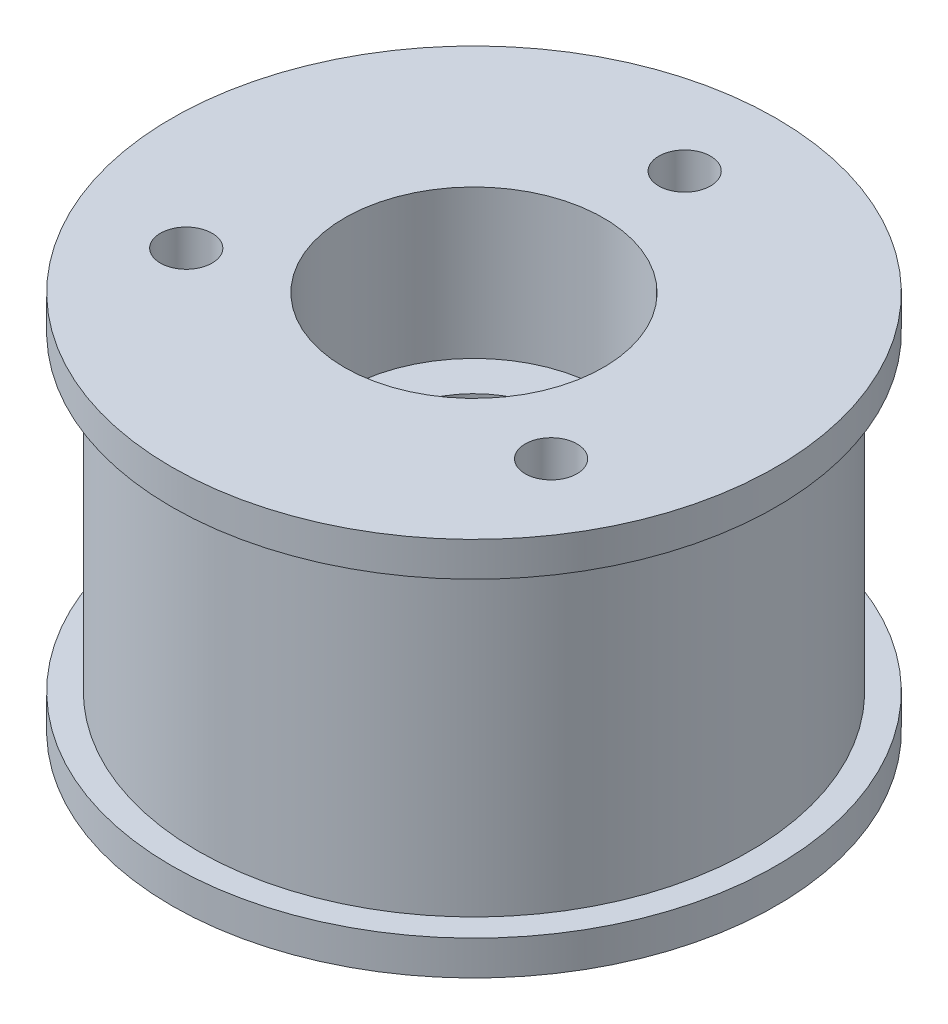
ISO-10303-21;
HEADER;
FILE_DESCRIPTION(('STEP AP214'),'2;1');
FILE_NAME('part.step','',(''),(''),'','','');
FILE_SCHEMA(('AUTOMOTIVE_DESIGN { 1 0 10303 214 1 1 1 1 }'));
ENDSEC;
DATA;
#1=APPLICATION_CONTEXT('core data for automotive mechanical design processes');
#2=APPLICATION_PROTOCOL_DEFINITION('international standard','automotive_design',2000,#1);
#3=PRODUCT_CONTEXT('',#1,'mechanical');
#4=PRODUCT('Part','Part','',(#3));
#5=PRODUCT_RELATED_PRODUCT_CATEGORY('part','',(#4));
#6=PRODUCT_DEFINITION_FORMATION('','',#4);
#7=PRODUCT_DEFINITION_CONTEXT('part definition',#1,'design');
#8=PRODUCT_DEFINITION('design','',#6,#7);
#9=PRODUCT_DEFINITION_SHAPE('','',#8);
#10=(LENGTH_UNIT() NAMED_UNIT(*) SI_UNIT(.MILLI.,.METRE.));
#11=(NAMED_UNIT(*) PLANE_ANGLE_UNIT() SI_UNIT($,.RADIAN.));
#12=(NAMED_UNIT(*) SI_UNIT($,.STERADIAN.) SOLID_ANGLE_UNIT());
#13=UNCERTAINTY_MEASURE_WITH_UNIT(LENGTH_MEASURE(1.E-05),#10,'distance_accuracy_value','');
#14=(GEOMETRIC_REPRESENTATION_CONTEXT(3) GLOBAL_UNCERTAINTY_ASSIGNED_CONTEXT((#13)) GLOBAL_UNIT_ASSIGNED_CONTEXT((#10,
#11,#12)) REPRESENTATION_CONTEXT('',''));
#15=CARTESIAN_POINT('',(0.,0.,0.));
#16=DIRECTION('',(0.,0.,1.));
#17=DIRECTION('',(1.,0.,0.));
#18=AXIS2_PLACEMENT_3D('',#15,#16,#17);
#19=CARTESIAN_POINT('',(0.,22.,0.));
#20=DIRECTION('',(0.,-1.,0.));
#21=DIRECTION('',(0.,0.,-1.));
#22=AXIS2_PLACEMENT_3D('',#19,#20,#21);
#23=CYLINDRICAL_SURFACE('',#22,17.5);
#24=CARTESIAN_POINT('',(0.,22.,0.));
#25=DIRECTION('',(0.,1.,0.));
#26=DIRECTION('',(0.,0.,1.));
#27=AXIS2_PLACEMENT_3D('',#24,#25,#26);
#28=CIRCLE('',#27,17.5);
#29=CARTESIAN_POINT('',(0.,22.,17.5));
#30=VERTEX_POINT('',#29);
#31=EDGE_CURVE('E10',#30,#30,#28,.T.);
#32=ORIENTED_EDGE('',*,*,#31,.F.);
#33=EDGE_LOOP('',(#32));
#34=FACE_BOUND('',#33,.T.);
#35=CARTESIAN_POINT('',(0.,20.,0.));
#36=DIRECTION('',(0.,-1.,0.));
#37=DIRECTION('',(0.,0.,-1.));
#38=AXIS2_PLACEMENT_3D('',#35,#36,#37);
#39=CIRCLE('',#38,17.5);
#40=CARTESIAN_POINT('',(0.,20.,-17.5));
#41=VERTEX_POINT('',#40);
#42=EDGE_CURVE('E102',#41,#41,#39,.T.);
#43=ORIENTED_EDGE('',*,*,#42,.F.);
#44=EDGE_LOOP('',(#43));
#45=FACE_BOUND('',#44,.T.);
#46=ADVANCED_FACE('F45',(#34,#45),#23,.T.);
#47=CARTESIAN_POINT('',(0.,22.,0.));
#48=DIRECTION('',(0.,1.,0.));
#49=DIRECTION('',(0.,0.,1.));
#50=AXIS2_PLACEMENT_3D('',#47,#48,#49);
#51=CYLINDRICAL_SURFACE('',#50,5.);
#52=CARTESIAN_POINT('',(0.,13.4,0.));
#53=DIRECTION('',(0.,1.,0.));
#54=DIRECTION('',(0.,0.,1.));
#55=AXIS2_PLACEMENT_3D('',#52,#53,#54);
#56=CIRCLE('',#55,5.);
#57=CARTESIAN_POINT('',(0.,13.4,5.));
#58=VERTEX_POINT('',#57);
#59=EDGE_CURVE('E60',#58,#58,#56,.T.);
#60=ORIENTED_EDGE('',*,*,#59,.T.);
#61=EDGE_LOOP('',(#60));
#62=FACE_BOUND('',#61,.T.);
#63=CARTESIAN_POINT('',(0.,3.5,0.));
#64=DIRECTION('',(0.,-1.,0.));
#65=DIRECTION('',(0.,0.,-1.));
#66=AXIS2_PLACEMENT_3D('',#63,#64,#65);
#67=CIRCLE('',#66,5.);
#68=CARTESIAN_POINT('',(0.,3.5,-5.));
#69=VERTEX_POINT('',#68);
#70=EDGE_CURVE('E49',#69,#69,#67,.F.);
#71=ORIENTED_EDGE('',*,*,#70,.F.);
#72=EDGE_LOOP('',(#71));
#73=FACE_BOUND('',#72,.T.);
#74=ADVANCED_FACE('F134',(#62,#73),#51,.F.);
#75=CARTESIAN_POINT('',(0.,2.,0.));
#76=DIRECTION('',(0.,-1.,0.));
#77=DIRECTION('',(0.,0.,-1.));
#78=AXIS2_PLACEMENT_3D('',#75,#76,#77);
#79=CIRCLE('',#78,17.5);
#80=CARTESIAN_POINT('',(0.,2.,-17.5));
#81=VERTEX_POINT('',#80);
#82=EDGE_CURVE('E106',#81,#81,#79,.T.);
#83=ORIENTED_EDGE('',*,*,#82,.T.);
#84=EDGE_LOOP('',(#83));
#85=FACE_BOUND('',#84,.T.);
#86=CARTESIAN_POINT('',(0.,0.,0.));
#87=DIRECTION('',(0.,1.,0.));
#88=DIRECTION('',(0.,0.,1.));
#89=AXIS2_PLACEMENT_3D('',#86,#87,#88);
#90=CIRCLE('',#89,17.5);
#91=CARTESIAN_POINT('',(0.,0.,17.5));
#92=VERTEX_POINT('',#91);
#93=EDGE_CURVE('E54',#92,#92,#90,.T.);
#94=ORIENTED_EDGE('',*,*,#93,.T.);
#95=EDGE_LOOP('',(#94));
#96=FACE_BOUND('',#95,.T.);
#97=ADVANCED_FACE('F47',(#85,#96),#23,.T.);
#98=CARTESIAN_POINT('',(0.,22.,0.));
#99=DIRECTION('',(0.,1.,0.));
#100=DIRECTION('',(0.,0.,1.));
#101=AXIS2_PLACEMENT_3D('',#98,#99,#100);
#102=PLANE('',#101);
#103=CARTESIAN_POINT('',(0.,22.,-12.2));
#104=DIRECTION('',(0.,1.,0.));
#105=DIRECTION('',(0.,0.,1.));
#106=AXIS2_PLACEMENT_3D('',#103,#104,#105);
#107=CIRCLE('',#106,1.5);
#108=CARTESIAN_POINT('',(0.,22.,-10.7));
#109=VERTEX_POINT('',#108);
#110=EDGE_CURVE('E93',#109,#109,#107,.T.);
#111=ORIENTED_EDGE('',*,*,#110,.F.);
#112=EDGE_LOOP('',(#111));
#113=FACE_BOUND('',#112,.T.);
#114=CARTESIAN_POINT('',(10.5655099261709,22.,6.09999999999955));
#115=DIRECTION('',(0.,1.,0.));
#116=DIRECTION('',(0.,0.,1.));
#117=AXIS2_PLACEMENT_3D('',#114,#115,#116);
#118=CIRCLE('',#117,1.5);
#119=CARTESIAN_POINT('',(10.5655099261709,22.,7.59999999999955));
#120=VERTEX_POINT('',#119);
#121=EDGE_CURVE('E85',#120,#120,#118,.T.);
#122=ORIENTED_EDGE('',*,*,#121,.F.);
#123=EDGE_LOOP('',(#122));
#124=FACE_BOUND('',#123,.T.);
#125=CARTESIAN_POINT('',(-10.5655099261694,22.,6.10000000000045));
#126=DIRECTION('',(0.,1.,0.));
#127=DIRECTION('',(0.,0.,1.));
#128=AXIS2_PLACEMENT_3D('',#125,#126,#127);
#129=CIRCLE('',#128,1.5);
#130=CARTESIAN_POINT('',(-10.5655099261694,22.,7.60000000000044));
#131=VERTEX_POINT('',#130);
#132=EDGE_CURVE('E77',#131,#131,#129,.T.);
#133=ORIENTED_EDGE('',*,*,#132,.F.);
#134=EDGE_LOOP('',(#133));
#135=FACE_BOUND('',#134,.T.);
#136=CARTESIAN_POINT('',(0.,22.,0.));
#137=DIRECTION('',(0.,1.,0.));
#138=DIRECTION('',(0.,0.,1.));
#139=AXIS2_PLACEMENT_3D('',#136,#137,#138);
#140=CIRCLE('',#139,7.5);
#141=CARTESIAN_POINT('',(0.,22.,7.5));
#142=VERTEX_POINT('',#141);
#143=EDGE_CURVE('E69',#142,#142,#140,.T.);
#144=ORIENTED_EDGE('',*,*,#143,.F.);
#145=EDGE_LOOP('',(#144));
#146=FACE_BOUND('',#145,.T.);
#147=ORIENTED_EDGE('',*,*,#31,.T.);
#148=EDGE_LOOP('',(#147));
#149=FACE_BOUND('',#148,.T.);
#150=ADVANCED_FACE('F143',(#113,#124,#135,#146,#149),#102,.T.);
#151=CARTESIAN_POINT('',(0.,0.,0.));
#152=DIRECTION('',(0.,1.,0.));
#153=DIRECTION('',(0.,0.,1.));
#154=AXIS2_PLACEMENT_3D('',#151,#152,#153);
#155=PLANE('',#154);
#156=CARTESIAN_POINT('',(0.,0.,0.));
#157=DIRECTION('',(0.,-1.,0.));
#158=DIRECTION('',(0.,0.,-1.));
#159=AXIS2_PLACEMENT_3D('',#156,#157,#158);
#160=CIRCLE('',#159,8.5);
#161=CARTESIAN_POINT('',(0.,0.,-8.5));
#162=VERTEX_POINT('',#161);
#163=EDGE_CURVE('E97',#162,#162,#160,.T.);
#164=ORIENTED_EDGE('',*,*,#163,.F.);
#165=EDGE_LOOP('',(#164));
#166=FACE_BOUND('',#165,.T.);
#167=CARTESIAN_POINT('',(0.,0.,-12.2));
#168=DIRECTION('',(0.,1.,0.));
#169=DIRECTION('',(0.,0.,1.));
#170=AXIS2_PLACEMENT_3D('',#167,#168,#169);
#171=CIRCLE('',#170,1.49999999999999);
#172=CARTESIAN_POINT('',(0.,0.,-10.7));
#173=VERTEX_POINT('',#172);
#174=EDGE_CURVE('E89',#173,#173,#171,.T.);
#175=ORIENTED_EDGE('',*,*,#174,.T.);
#176=EDGE_LOOP('',(#175));
#177=FACE_BOUND('',#176,.T.);
#178=CARTESIAN_POINT('',(10.5655099261709,0.,6.09999999999955));
#179=DIRECTION('',(0.,1.,0.));
#180=DIRECTION('',(0.,0.,1.));
#181=AXIS2_PLACEMENT_3D('',#178,#179,#180);
#182=CIRCLE('',#181,1.49999999999999);
#183=CARTESIAN_POINT('',(10.5655099261709,0.,7.59999999999954));
#184=VERTEX_POINT('',#183);
#185=EDGE_CURVE('E81',#184,#184,#182,.T.);
#186=ORIENTED_EDGE('',*,*,#185,.T.);
#187=EDGE_LOOP('',(#186));
#188=FACE_BOUND('',#187,.T.);
#189=CARTESIAN_POINT('',(-10.5655099261694,0.,6.10000000000045));
#190=DIRECTION('',(0.,1.,0.));
#191=DIRECTION('',(0.,0.,1.));
#192=AXIS2_PLACEMENT_3D('',#189,#190,#191);
#193=CIRCLE('',#192,1.49999999999999);
#194=CARTESIAN_POINT('',(-10.5655099261694,0.,7.60000000000044));
#195=VERTEX_POINT('',#194);
#196=EDGE_CURVE('E73',#195,#195,#193,.T.);
#197=ORIENTED_EDGE('',*,*,#196,.T.);
#198=EDGE_LOOP('',(#197));
#199=FACE_BOUND('',#198,.T.);
#200=ORIENTED_EDGE('',*,*,#93,.F.);
#201=EDGE_LOOP('',(#200));
#202=FACE_BOUND('',#201,.T.);
#203=ADVANCED_FACE('F148',(#166,#177,#188,#199,#202),#155,.F.);
#204=CARTESIAN_POINT('',(5.,13.4,0.));
#205=DIRECTION('',(0.,-1.,0.));
#206=DIRECTION('',(0.,0.,-1.));
#207=AXIS2_PLACEMENT_3D('',#204,#205,#206);
#208=PLANE('',#207);
#209=ORIENTED_EDGE('',*,*,#59,.F.);
#210=EDGE_LOOP('',(#209));
#211=FACE_BOUND('',#210,.T.);
#212=CARTESIAN_POINT('',(0.,13.4,0.));
#213=DIRECTION('',(0.,1.,0.));
#214=DIRECTION('',(0.,0.,1.));
#215=AXIS2_PLACEMENT_3D('',#212,#213,#214);
#216=CIRCLE('',#215,7.5);
#217=CARTESIAN_POINT('',(0.,13.4,7.5));
#218=VERTEX_POINT('',#217);
#219=EDGE_CURVE('E65',#218,#218,#216,.T.);
#220=ORIENTED_EDGE('',*,*,#219,.T.);
#221=EDGE_LOOP('',(#220));
#222=FACE_BOUND('',#221,.T.);
#223=ADVANCED_FACE('F156',(#211,#222),#208,.F.);
#224=CARTESIAN_POINT('',(0.,22.,0.));
#225=DIRECTION('',(0.,1.,0.));
#226=DIRECTION('',(0.,0.,1.));
#227=AXIS2_PLACEMENT_3D('',#224,#225,#226);
#228=CYLINDRICAL_SURFACE('',#227,7.5);
#229=ORIENTED_EDGE('',*,*,#219,.F.);
#230=EDGE_LOOP('',(#229));
#231=FACE_BOUND('',#230,.T.);
#232=ORIENTED_EDGE('',*,*,#143,.T.);
#233=EDGE_LOOP('',(#232));
#234=FACE_BOUND('',#233,.T.);
#235=ADVANCED_FACE('F162',(#231,#234),#228,.F.);
#236=CARTESIAN_POINT('',(-10.5655099261694,22.,6.10000000000045));
#237=DIRECTION('',(0.,1.,0.));
#238=DIRECTION('',(0.,0.,1.));
#239=AXIS2_PLACEMENT_3D('',#236,#237,#238);
#240=CYLINDRICAL_SURFACE('',#239,1.5);
#241=ORIENTED_EDGE('',*,*,#196,.F.);
#242=EDGE_LOOP('',(#241));
#243=FACE_BOUND('',#242,.T.);
#244=ORIENTED_EDGE('',*,*,#132,.T.);
#245=EDGE_LOOP('',(#244));
#246=FACE_BOUND('',#245,.T.);
#247=ADVANCED_FACE('F170',(#243,#246),#240,.F.);
#248=CARTESIAN_POINT('',(10.5655099261709,22.,6.09999999999955));
#249=DIRECTION('',(0.,1.,0.));
#250=DIRECTION('',(0.,0.,1.));
#251=AXIS2_PLACEMENT_3D('',#248,#249,#250);
#252=CYLINDRICAL_SURFACE('',#251,1.5);
#253=ORIENTED_EDGE('',*,*,#185,.F.);
#254=EDGE_LOOP('',(#253));
#255=FACE_BOUND('',#254,.T.);
#256=ORIENTED_EDGE('',*,*,#121,.T.);
#257=EDGE_LOOP('',(#256));
#258=FACE_BOUND('',#257,.T.);
#259=ADVANCED_FACE('F174',(#255,#258),#252,.F.);
#260=CARTESIAN_POINT('',(0.,22.,-12.2));
#261=DIRECTION('',(0.,1.,0.));
#262=DIRECTION('',(0.,0.,1.));
#263=AXIS2_PLACEMENT_3D('',#260,#261,#262);
#264=CYLINDRICAL_SURFACE('',#263,1.5);
#265=ORIENTED_EDGE('',*,*,#174,.F.);
#266=EDGE_LOOP('',(#265));
#267=FACE_BOUND('',#266,.T.);
#268=ORIENTED_EDGE('',*,*,#110,.T.);
#269=EDGE_LOOP('',(#268));
#270=FACE_BOUND('',#269,.T.);
#271=ADVANCED_FACE('F178',(#267,#270),#264,.F.);
#272=CARTESIAN_POINT('',(0.,3.5,0.));
#273=DIRECTION('',(0.,-1.,0.));
#274=DIRECTION('',(0.,0.,-1.));
#275=AXIS2_PLACEMENT_3D('',#272,#273,#274);
#276=PLANE('',#275);
#277=CARTESIAN_POINT('',(0.,3.5,0.));
#278=DIRECTION('',(0.,-1.,0.));
#279=DIRECTION('',(0.,0.,-1.));
#280=AXIS2_PLACEMENT_3D('',#277,#278,#279);
#281=CIRCLE('',#280,8.5);
#282=CARTESIAN_POINT('',(0.,3.5,-8.5));
#283=VERTEX_POINT('',#282);
#284=EDGE_CURVE('E101',#283,#283,#281,.T.);
#285=ORIENTED_EDGE('',*,*,#284,.T.);
#286=EDGE_LOOP('',(#285));
#287=FACE_BOUND('',#286,.T.);
#288=ORIENTED_EDGE('',*,*,#70,.T.);
#289=EDGE_LOOP('',(#288));
#290=FACE_BOUND('',#289,.T.);
#291=ADVANCED_FACE('F182',(#287,#290),#276,.T.);
#292=CARTESIAN_POINT('',(0.,3.5,0.));
#293=DIRECTION('',(0.,-1.,0.));
#294=DIRECTION('',(0.,0.,-1.));
#295=AXIS2_PLACEMENT_3D('',#292,#293,#294);
#296=CYLINDRICAL_SURFACE('',#295,8.5);
#297=ORIENTED_EDGE('',*,*,#284,.F.);
#298=EDGE_LOOP('',(#297));
#299=FACE_BOUND('',#298,.T.);
#300=ORIENTED_EDGE('',*,*,#163,.T.);
#301=EDGE_LOOP('',(#300));
#302=FACE_BOUND('',#301,.T.);
#303=ADVANCED_FACE('F129',(#299,#302),#296,.F.);
#304=CARTESIAN_POINT('',(0.,20.,0.));
#305=DIRECTION('',(0.,-1.,0.));
#306=DIRECTION('',(0.,0.,-1.));
#307=AXIS2_PLACEMENT_3D('',#304,#305,#306);
#308=PLANE('',#307);
#309=CARTESIAN_POINT('',(0.,20.,0.));
#310=DIRECTION('',(0.,-1.,0.));
#311=DIRECTION('',(0.,0.,-1.));
#312=AXIS2_PLACEMENT_3D('',#309,#310,#311);
#313=CIRCLE('',#312,16.);
#314=CARTESIAN_POINT('',(0.,20.,-16.));
#315=VERTEX_POINT('',#314);
#316=EDGE_CURVE('E110',#315,#315,#313,.T.);
#317=ORIENTED_EDGE('',*,*,#316,.F.);
#318=EDGE_LOOP('',(#317));
#319=FACE_BOUND('',#318,.T.);
#320=ORIENTED_EDGE('',*,*,#42,.T.);
#321=EDGE_LOOP('',(#320));
#322=FACE_BOUND('',#321,.T.);
#323=ADVANCED_FACE('F125',(#319,#322),#308,.T.);
#324=CARTESIAN_POINT('',(0.,2.,0.));
#325=DIRECTION('',(0.,-1.,0.));
#326=DIRECTION('',(0.,0.,-1.));
#327=AXIS2_PLACEMENT_3D('',#324,#325,#326);
#328=PLANE('',#327);
#329=CARTESIAN_POINT('',(0.,2.,0.));
#330=DIRECTION('',(0.,-1.,0.));
#331=DIRECTION('',(0.,0.,-1.));
#332=AXIS2_PLACEMENT_3D('',#329,#330,#331);
#333=CIRCLE('',#332,16.);
#334=CARTESIAN_POINT('',(0.,2.,-16.));
#335=VERTEX_POINT('',#334);
#336=EDGE_CURVE('E114',#335,#335,#333,.T.);
#337=ORIENTED_EDGE('',*,*,#336,.T.);
#338=EDGE_LOOP('',(#337));
#339=FACE_BOUND('',#338,.T.);
#340=ORIENTED_EDGE('',*,*,#82,.F.);
#341=EDGE_LOOP('',(#340));
#342=FACE_BOUND('',#341,.T.);
#343=ADVANCED_FACE('F128',(#339,#342),#328,.F.);
#344=CARTESIAN_POINT('',(0.,20.,0.));
#345=DIRECTION('',(0.,-1.,0.));
#346=DIRECTION('',(0.,0.,-1.));
#347=AXIS2_PLACEMENT_3D('',#344,#345,#346);
#348=CYLINDRICAL_SURFACE('',#347,16.);
#349=ORIENTED_EDGE('',*,*,#316,.T.);
#350=EDGE_LOOP('',(#349));
#351=FACE_BOUND('',#350,.T.);
#352=ORIENTED_EDGE('',*,*,#336,.F.);
#353=EDGE_LOOP('',(#352));
#354=FACE_BOUND('',#353,.T.);
#355=ADVANCED_FACE('F122',(#351,#354),#348,.T.);
#356=CLOSED_SHELL('',(#46,#74,#97,#150,#203,#223,#235,#247,#259,#271,#291,#303,#323,#343,#355));
#357=MANIFOLD_SOLID_BREP('B2',#356);
#358=ADVANCED_BREP_SHAPE_REPRESENTATION('',(#18,#357),#14);
#359=SHAPE_DEFINITION_REPRESENTATION(#9,#358);
ENDSEC;
END-ISO-10303-21;
